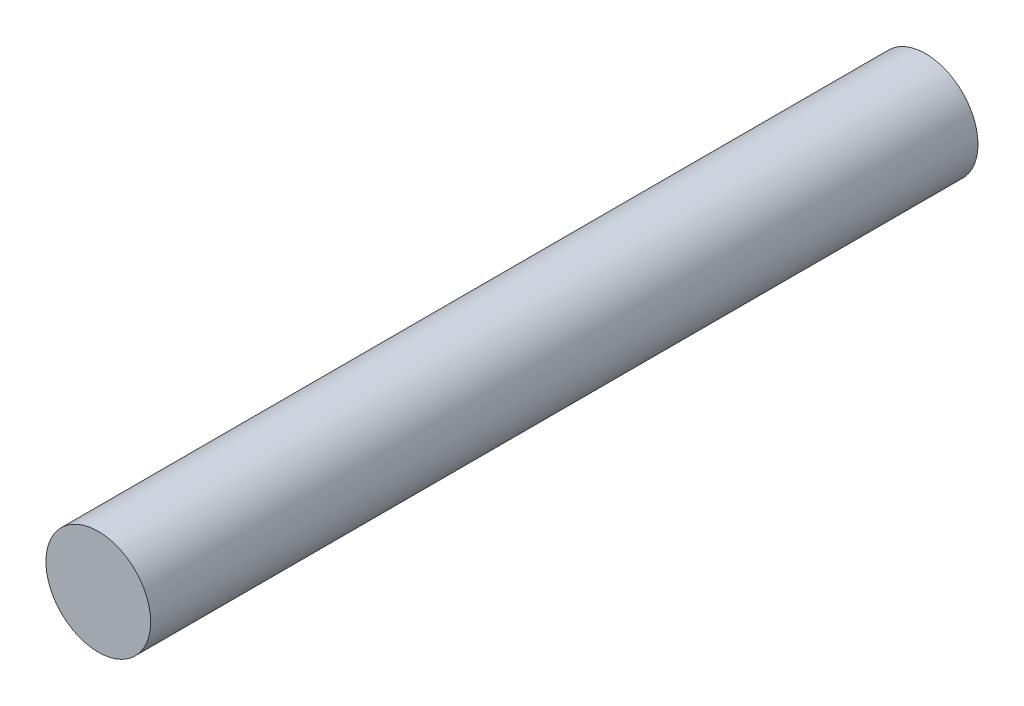
ISO-10303-21;
HEADER;
FILE_DESCRIPTION(('STEP AP214'),'2;1');
FILE_NAME('part.step','',(''),(''),'','','');
FILE_SCHEMA(('AUTOMOTIVE_DESIGN { 1 0 10303 214 1 1 1 1 }'));
ENDSEC;
DATA;
#1=APPLICATION_CONTEXT('core data for automotive mechanical design processes');
#2=APPLICATION_PROTOCOL_DEFINITION('international standard','automotive_design',2000,#1);
#3=PRODUCT_CONTEXT('',#1,'mechanical');
#4=PRODUCT('Part','Part','',(#3));
#5=PRODUCT_RELATED_PRODUCT_CATEGORY('part','',(#4));
#6=PRODUCT_DEFINITION_FORMATION('','',#4);
#7=PRODUCT_DEFINITION_CONTEXT('part definition',#1,'design');
#8=PRODUCT_DEFINITION('design','',#6,#7);
#9=PRODUCT_DEFINITION_SHAPE('','',#8);
#10=(LENGTH_UNIT() NAMED_UNIT(*) SI_UNIT(.MILLI.,.METRE.));
#11=(NAMED_UNIT(*) PLANE_ANGLE_UNIT() SI_UNIT($,.RADIAN.));
#12=(NAMED_UNIT(*) SI_UNIT($,.STERADIAN.) SOLID_ANGLE_UNIT());
#13=UNCERTAINTY_MEASURE_WITH_UNIT(LENGTH_MEASURE(1.E-05),#10,'distance_accuracy_value','');
#14=(GEOMETRIC_REPRESENTATION_CONTEXT(3) GLOBAL_UNCERTAINTY_ASSIGNED_CONTEXT((#13)) GLOBAL_UNIT_ASSIGNED_CONTEXT((#10,
#11,#12)) REPRESENTATION_CONTEXT('',''));
#15=CARTESIAN_POINT('',(0.,0.,0.));
#16=DIRECTION('',(0.,0.,1.));
#17=DIRECTION('',(1.,0.,0.));
#18=AXIS2_PLACEMENT_3D('',#15,#16,#17);
#19=CARTESIAN_POINT('',(-0.246030654163967,0.,7.9));
#20=DIRECTION('',(0.,0.,-1.));
#21=DIRECTION('',(-1.,0.,0.));
#22=AXIS2_PLACEMENT_3D('',#19,#20,#21);
#23=CYLINDRICAL_SURFACE('',#22,1.);
#24=CARTESIAN_POINT('',(-0.246030654163967,0.,7.9));
#25=DIRECTION('',(0.,0.,1.));
#26=DIRECTION('',(1.,0.,0.));
#27=AXIS2_PLACEMENT_3D('',#24,#25,#26);
#28=CIRCLE('',#27,1.);
#29=CARTESIAN_POINT('',(0.753969345836033,0.,7.9));
#30=VERTEX_POINT('',#29);
#31=EDGE_CURVE('E10',#30,#30,#28,.T.);
#32=ORIENTED_EDGE('',*,*,#31,.F.);
#33=EDGE_LOOP('',(#32));
#34=FACE_BOUND('',#33,.T.);
#35=CARTESIAN_POINT('',(-0.246030654163967,0.,-7.9));
#36=DIRECTION('',(0.,0.,1.));
#37=DIRECTION('',(1.,0.,0.));
#38=AXIS2_PLACEMENT_3D('',#35,#36,#37);
#39=CIRCLE('',#38,1.);
#40=CARTESIAN_POINT('',(0.753969345836033,0.,-7.9));
#41=VERTEX_POINT('',#40);
#42=EDGE_CURVE('E40',#41,#41,#39,.T.);
#43=ORIENTED_EDGE('',*,*,#42,.T.);
#44=EDGE_LOOP('',(#43));
#45=FACE_BOUND('',#44,.T.);
#46=ADVANCED_FACE('F37',(#34,#45),#23,.T.);
#47=CARTESIAN_POINT('',(-0.246030654163967,0.,7.9));
#48=DIRECTION('',(0.,0.,1.));
#49=DIRECTION('',(1.,0.,0.));
#50=AXIS2_PLACEMENT_3D('',#47,#48,#49);
#51=PLANE('',#50);
#52=ORIENTED_EDGE('',*,*,#31,.T.);
#53=EDGE_LOOP('',(#52));
#54=FACE_BOUND('',#53,.T.);
#55=ADVANCED_FACE('F54',(#54),#51,.T.);
#56=CARTESIAN_POINT('',(-0.246030654163967,0.,-7.9));
#57=DIRECTION('',(0.,0.,1.));
#58=DIRECTION('',(1.,0.,0.));
#59=AXIS2_PLACEMENT_3D('',#56,#57,#58);
#60=PLANE('',#59);
#61=ORIENTED_EDGE('',*,*,#42,.F.);
#62=EDGE_LOOP('',(#61));
#63=FACE_BOUND('',#62,.T.);
#64=ADVANCED_FACE('F52',(#63),#60,.F.);
#65=CLOSED_SHELL('',(#46,#55,#64));
#66=MANIFOLD_SOLID_BREP('B2',#65);
#67=ADVANCED_BREP_SHAPE_REPRESENTATION('',(#18,#66),#14);
#68=SHAPE_DEFINITION_REPRESENTATION(#9,#67);
ENDSEC;
END-ISO-10303-21;
